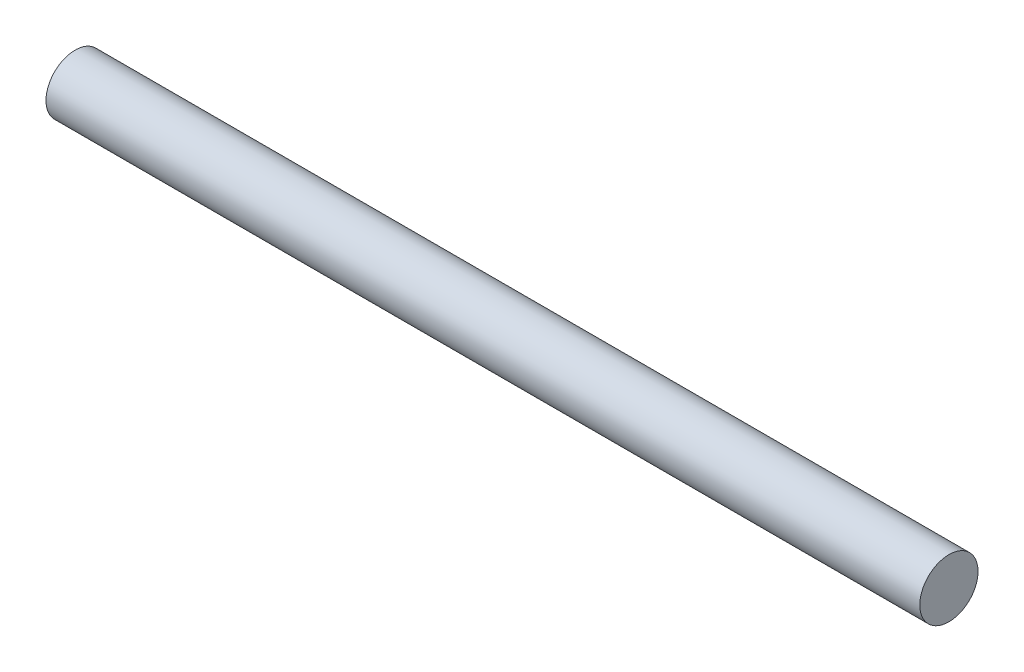
ISO-10303-21;
HEADER;
FILE_DESCRIPTION(('STEP AP214'),'2;1');
FILE_NAME('part.step','',(''),(''),'','','');
FILE_SCHEMA(('AUTOMOTIVE_DESIGN { 1 0 10303 214 1 1 1 1 }'));
ENDSEC;
DATA;
#1=APPLICATION_CONTEXT('core data for automotive mechanical design processes');
#2=APPLICATION_PROTOCOL_DEFINITION('international standard','automotive_design',2000,#1);
#3=PRODUCT_CONTEXT('',#1,'mechanical');
#4=PRODUCT('Part','Part','',(#3));
#5=PRODUCT_RELATED_PRODUCT_CATEGORY('part','',(#4));
#6=PRODUCT_DEFINITION_FORMATION('','',#4);
#7=PRODUCT_DEFINITION_CONTEXT('part definition',#1,'design');
#8=PRODUCT_DEFINITION('design','',#6,#7);
#9=PRODUCT_DEFINITION_SHAPE('','',#8);
#10=(LENGTH_UNIT() NAMED_UNIT(*) SI_UNIT(.MILLI.,.METRE.));
#11=(NAMED_UNIT(*) PLANE_ANGLE_UNIT() SI_UNIT($,.RADIAN.));
#12=(NAMED_UNIT(*) SI_UNIT($,.STERADIAN.) SOLID_ANGLE_UNIT());
#13=UNCERTAINTY_MEASURE_WITH_UNIT(LENGTH_MEASURE(1.E-05),#10,'distance_accuracy_value','');
#14=(GEOMETRIC_REPRESENTATION_CONTEXT(3) GLOBAL_UNCERTAINTY_ASSIGNED_CONTEXT((#13)) GLOBAL_UNIT_ASSIGNED_CONTEXT((#10,
#11,#12)) REPRESENTATION_CONTEXT('',''));
#15=CARTESIAN_POINT('',(0.,0.,0.));
#16=DIRECTION('',(0.,0.,1.));
#17=DIRECTION('',(1.,0.,0.));
#18=AXIS2_PLACEMENT_3D('',#15,#16,#17);
#19=CARTESIAN_POINT('',(180.,0.,0.));
#20=DIRECTION('',(-1.,0.,0.));
#21=DIRECTION('',(0.,0.,1.));
#22=AXIS2_PLACEMENT_3D('',#19,#20,#21);
#23=CYLINDRICAL_SURFACE('',#22,6.);
#24=CARTESIAN_POINT('',(180.,0.,0.));
#25=DIRECTION('',(1.,0.,0.));
#26=DIRECTION('',(0.,0.,-1.));
#27=AXIS2_PLACEMENT_3D('',#24,#25,#26);
#28=CIRCLE('',#27,6.);
#29=CARTESIAN_POINT('',(180.,0.,6.));
#30=VERTEX_POINT('',#29);
#31=EDGE_CURVE('E10',#30,#30,#28,.T.);
#32=CARTESIAN_POINT('',(0.,0.,0.));
#33=DIRECTION('',(1.,0.,0.));
#34=DIRECTION('',(0.,0.,-1.));
#35=AXIS2_PLACEMENT_3D('',#32,#33,#34);
#36=CIRCLE('',#35,6.);
#37=CARTESIAN_POINT('',(0.,0.,6.));
#38=VERTEX_POINT('',#37);
#39=EDGE_CURVE('E46',#38,#38,#36,.T.);
#40=CARTESIAN_POINT('',(180.,0.,6.));
#41=CARTESIAN_POINT('',(178.125,0.,6.));
#42=CARTESIAN_POINT('',(176.25,0.,6.));
#43=CARTESIAN_POINT('',(172.5,0.,6.));
#44=CARTESIAN_POINT('',(170.625,0.,6.));
#45=CARTESIAN_POINT('',(166.875,0.,6.));
#46=CARTESIAN_POINT('',(165.,0.,6.));
#47=CARTESIAN_POINT('',(161.25,0.,6.));
#48=CARTESIAN_POINT('',(159.375,0.,6.));
#49=CARTESIAN_POINT('',(155.625,0.,6.));
#50=CARTESIAN_POINT('',(153.75,0.,6.));
#51=CARTESIAN_POINT('',(150.,0.,6.));
#52=CARTESIAN_POINT('',(148.125,0.,6.));
#53=CARTESIAN_POINT('',(144.375,0.,6.));
#54=CARTESIAN_POINT('',(142.5,0.,6.));
#55=CARTESIAN_POINT('',(138.75,0.,6.));
#56=CARTESIAN_POINT('',(136.875,0.,6.));
#57=CARTESIAN_POINT('',(133.125,0.,6.));
#58=CARTESIAN_POINT('',(131.25,0.,6.));
#59=CARTESIAN_POINT('',(127.5,0.,6.));
#60=CARTESIAN_POINT('',(125.625,0.,6.));
#61=CARTESIAN_POINT('',(121.875,0.,6.));
#62=CARTESIAN_POINT('',(120.,0.,6.));
#63=CARTESIAN_POINT('',(116.25,0.,6.));
#64=CARTESIAN_POINT('',(114.375,0.,6.));
#65=CARTESIAN_POINT('',(110.625,0.,6.));
#66=CARTESIAN_POINT('',(108.75,0.,6.));
#67=CARTESIAN_POINT('',(105.,0.,6.));
#68=CARTESIAN_POINT('',(103.125,0.,6.));
#69=CARTESIAN_POINT('',(99.375,0.,6.));
#70=CARTESIAN_POINT('',(97.5,0.,6.));
#71=CARTESIAN_POINT('',(93.75,0.,6.));
#72=CARTESIAN_POINT('',(91.875,0.,6.));
#73=CARTESIAN_POINT('',(88.125,0.,6.));
#74=CARTESIAN_POINT('',(86.25,0.,6.));
#75=CARTESIAN_POINT('',(82.5,0.,6.));
#76=CARTESIAN_POINT('',(80.625,0.,6.));
#77=CARTESIAN_POINT('',(76.875,0.,6.));
#78=CARTESIAN_POINT('',(75.,0.,6.));
#79=CARTESIAN_POINT('',(71.25,0.,6.));
#80=CARTESIAN_POINT('',(69.375,0.,6.));
#81=CARTESIAN_POINT('',(65.625,0.,6.));
#82=CARTESIAN_POINT('',(63.75,0.,6.));
#83=CARTESIAN_POINT('',(60.,0.,6.));
#84=CARTESIAN_POINT('',(58.125,0.,6.));
#85=CARTESIAN_POINT('',(54.375,0.,6.));
#86=CARTESIAN_POINT('',(52.5,0.,6.));
#87=CARTESIAN_POINT('',(48.75,0.,6.));
#88=CARTESIAN_POINT('',(46.875,0.,6.));
#89=CARTESIAN_POINT('',(43.125,0.,6.));
#90=CARTESIAN_POINT('',(41.25,0.,6.));
#91=CARTESIAN_POINT('',(37.5,0.,6.));
#92=CARTESIAN_POINT('',(35.625,0.,6.));
#93=CARTESIAN_POINT('',(31.875,0.,6.));
#94=CARTESIAN_POINT('',(30.,0.,6.));
#95=CARTESIAN_POINT('',(26.25,0.,6.));
#96=CARTESIAN_POINT('',(24.375,0.,6.));
#97=CARTESIAN_POINT('',(20.625,0.,6.));
#98=CARTESIAN_POINT('',(18.75,0.,6.));
#99=CARTESIAN_POINT('',(15.,0.,6.));
#100=CARTESIAN_POINT('',(13.125,0.,6.));
#101=CARTESIAN_POINT('',(9.37499999999998,0.,6.));
#102=CARTESIAN_POINT('',(7.49999999999997,0.,6.));
#103=CARTESIAN_POINT('',(3.74999999999997,0.,6.));
#104=CARTESIAN_POINT('',(1.87499999999997,0.,6.));
#105=CARTESIAN_POINT('',(0.,0.,6.));
#106=B_SPLINE_CURVE_WITH_KNOTS('',3,(#40,#41,#42,#43,#44,#45,#46,#47,#48,#49,#50,#51,#52,#53,
#54,#55,#56,#57,#58,#59,#60,#61,#62,#63,#64,#65,#66,#67,#68,#69,#70,#71,#72,#73,#74,#75,#76,#77,
#78,#79,#80,#81,#82,#83,#84,#85,#86,#87,#88,#89,#90,#91,#92,#93,#94,#95,#96,#97,#98,#99,#100,
#101,#102,#103,#104,#105),.UNSPECIFIED.,.F.,.F.,(4,2,2,2,2,2,2,2,2,2,2,2,2,2,2,2,2,2,2,2,2,2,2,
2,2,2,2,2,2,2,2,2,4),(0.,5.62499999999999,11.25,16.875,22.5,28.125,33.75,39.375,45.,50.625,
56.25,61.875,67.5,73.125,78.75,84.375,90.,95.625,101.25,106.875,112.5,118.125,123.75,129.375,
135.,140.625,146.25,151.875,157.5,163.125,168.75,174.375,180.),.UNSPECIFIED.);
#107=EDGE_CURVE('BSEAM43',#30,#38,#106,.T.);
#108=ORIENTED_EDGE('',*,*,#31,.F.);
#109=ORIENTED_EDGE('',*,*,#39,.T.);
#110=ORIENTED_EDGE('',*,*,#107,.T.);
#111=ORIENTED_EDGE('',*,*,#107,.F.);
#112=EDGE_LOOP('',(#108,#110,#109,#111));
#113=FACE_BOUND('',#112,.T.);
#114=ADVANCED_FACE('F43',(#113),#23,.T.);
#115=CARTESIAN_POINT('',(180.,0.,0.));
#116=DIRECTION('',(1.,0.,0.));
#117=DIRECTION('',(0.,0.,-1.));
#118=AXIS2_PLACEMENT_3D('',#115,#116,#117);
#119=PLANE('',#118);
#120=ORIENTED_EDGE('',*,*,#31,.T.);
#121=EDGE_LOOP('',(#120));
#122=FACE_BOUND('',#121,.T.);
#123=ADVANCED_FACE('F58',(#122),#119,.T.);
#124=CARTESIAN_POINT('',(0.,0.,0.));
#125=DIRECTION('',(1.,0.,0.));
#126=DIRECTION('',(0.,0.,-1.));
#127=AXIS2_PLACEMENT_3D('',#124,#125,#126);
#128=PLANE('',#127);
#129=ORIENTED_EDGE('',*,*,#39,.F.);
#130=EDGE_LOOP('',(#129));
#131=FACE_BOUND('',#130,.T.);
#132=ADVANCED_FACE('F59',(#131),#128,.F.);
#133=CLOSED_SHELL('',(#114,#123,#132));
#134=MANIFOLD_SOLID_BREP('B2',#133);
#135=ADVANCED_BREP_SHAPE_REPRESENTATION('',(#18,#134),#14);
#136=SHAPE_DEFINITION_REPRESENTATION(#9,#135);
ENDSEC;
END-ISO-10303-21;
